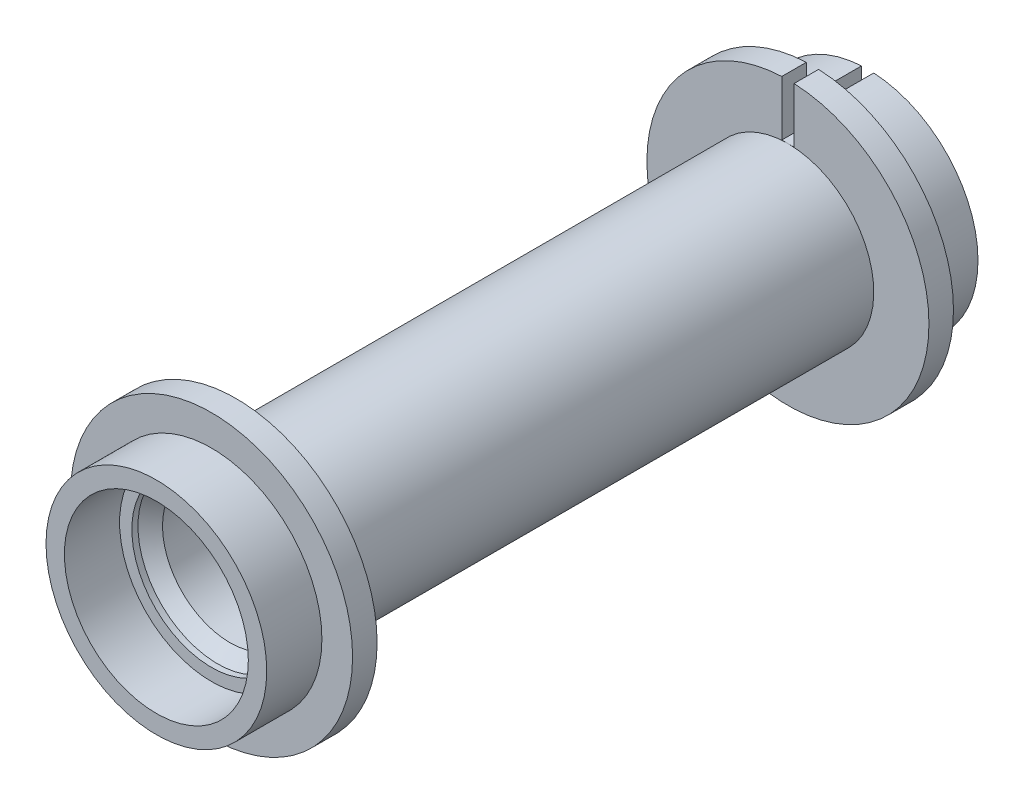
ISO-10303-21;
HEADER;
FILE_DESCRIPTION(('STEP AP214'),'2;1');
FILE_NAME('part.step','',(''),(''),'','','');
FILE_SCHEMA(('AUTOMOTIVE_DESIGN { 1 0 10303 214 1 1 1 1 }'));
ENDSEC;
DATA;
#1=APPLICATION_CONTEXT('core data for automotive mechanical design processes');
#2=APPLICATION_PROTOCOL_DEFINITION('international standard','automotive_design',2000,#1);
#3=PRODUCT_CONTEXT('',#1,'mechanical');
#4=PRODUCT('Part','Part','',(#3));
#5=PRODUCT_RELATED_PRODUCT_CATEGORY('part','',(#4));
#6=PRODUCT_DEFINITION_FORMATION('','',#4);
#7=PRODUCT_DEFINITION_CONTEXT('part definition',#1,'design');
#8=PRODUCT_DEFINITION('design','',#6,#7);
#9=PRODUCT_DEFINITION_SHAPE('','',#8);
#10=(LENGTH_UNIT() NAMED_UNIT(*) SI_UNIT(.MILLI.,.METRE.));
#11=(NAMED_UNIT(*) PLANE_ANGLE_UNIT() SI_UNIT($,.RADIAN.));
#12=(NAMED_UNIT(*) SI_UNIT($,.STERADIAN.) SOLID_ANGLE_UNIT());
#13=UNCERTAINTY_MEASURE_WITH_UNIT(LENGTH_MEASURE(1.E-05),#10,'distance_accuracy_value','');
#14=(GEOMETRIC_REPRESENTATION_CONTEXT(3) GLOBAL_UNCERTAINTY_ASSIGNED_CONTEXT((#13)) GLOBAL_UNIT_ASSIGNED_CONTEXT((#10,
#11,#12)) REPRESENTATION_CONTEXT('',''));
#15=CARTESIAN_POINT('',(0.,0.,0.));
#16=DIRECTION('',(0.,0.,1.));
#17=DIRECTION('',(1.,0.,0.));
#18=AXIS2_PLACEMENT_3D('',#15,#16,#17);
#19=CARTESIAN_POINT('',(0.,0.,-2.));
#20=DIRECTION('',(0.,0.,-1.));
#21=DIRECTION('',(1.,0.,0.));
#22=AXIS2_PLACEMENT_3D('',#19,#20,#21);
#23=PLANE('',#22);
#24=DIRECTION('',(0.,-1.,0.));
#25=VECTOR('',#24,1.);
#26=CARTESIAN_POINT('',(0.5,0.,-2.));
#27=LINE('',#26,#25);
#28=CARTESIAN_POINT('',(0.5,7.48331477354788,-2.));
#29=VERTEX_POINT('',#28);
#30=CARTESIAN_POINT('',(0.5,7.,-2.));
#31=VERTEX_POINT('',#30);
#32=EDGE_CURVE('E133',#29,#31,#27,.T.);
#33=ORIENTED_EDGE('',*,*,#32,.F.);
#34=CARTESIAN_POINT('',(0.,0.,-2.));
#35=DIRECTION('',(0.,0.,1.));
#36=DIRECTION('',(1.,0.,0.));
#37=AXIS2_PLACEMENT_3D('',#34,#35,#36);
#38=CIRCLE('',#37,7.5);
#39=CARTESIAN_POINT('',(-0.5,7.48331477354788,-2.));
#40=VERTEX_POINT('',#39);
#41=EDGE_CURVE('E142',#40,#29,#38,.T.);
#42=ORIENTED_EDGE('',*,*,#41,.F.);
#43=DIRECTION('',(0.,1.,0.));
#44=VECTOR('',#43,1.);
#45=CARTESIAN_POINT('',(-0.500000000000003,0.,-2.));
#46=LINE('',#45,#44);
#47=CARTESIAN_POINT('',(-0.5,7.,-2.));
#48=VERTEX_POINT('',#47);
#49=EDGE_CURVE('E51',#48,#40,#46,.T.);
#50=ORIENTED_EDGE('',*,*,#49,.F.);
#51=DIRECTION('',(-1.,0.,0.));
#52=VECTOR('',#51,1.);
#53=CARTESIAN_POINT('',(0.,7.,-2.));
#54=LINE('',#53,#52);
#55=EDGE_CURVE('E116',#31,#48,#54,.T.);
#56=ORIENTED_EDGE('',*,*,#55,.F.);
#57=EDGE_LOOP('',(#33,#42,#50,#56));
#58=FACE_BOUND('',#57,.T.);
#59=CARTESIAN_POINT('',(0.,0.,-2.));
#60=DIRECTION('',(0.,0.,1.));
#61=DIRECTION('',(1.,0.,0.));
#62=AXIS2_PLACEMENT_3D('',#59,#60,#61);
#63=CIRCLE('',#62,6.5);
#64=CARTESIAN_POINT('',(6.5,0.,-2.));
#65=VERTEX_POINT('',#64);
#66=EDGE_CURVE('E151',#65,#65,#63,.T.);
#67=ORIENTED_EDGE('',*,*,#66,.T.);
#68=EDGE_LOOP('',(#67));
#69=FACE_BOUND('',#68,.T.);
#70=ADVANCED_FACE('F36',(#58,#69),#23,.T.);
#71=CARTESIAN_POINT('',(0.,0.,47.));
#72=DIRECTION('',(0.,0.,1.));
#73=DIRECTION('',(1.,0.,0.));
#74=AXIS2_PLACEMENT_3D('',#71,#72,#73);
#75=PLANE('',#74);
#76=CARTESIAN_POINT('',(0.,0.,47.));
#77=DIRECTION('',(0.,0.,1.));
#78=DIRECTION('',(1.,0.,0.));
#79=AXIS2_PLACEMENT_3D('',#76,#77,#78);
#80=CIRCLE('',#79,6.5);
#81=CARTESIAN_POINT('',(6.5,0.,47.));
#82=VERTEX_POINT('',#81);
#83=EDGE_CURVE('E167',#82,#82,#80,.T.);
#84=ORIENTED_EDGE('',*,*,#83,.F.);
#85=EDGE_LOOP('',(#84));
#86=FACE_BOUND('',#85,.T.);
#87=CARTESIAN_POINT('',(0.,0.,47.));
#88=DIRECTION('',(0.,0.,1.));
#89=DIRECTION('',(1.,0.,0.));
#90=AXIS2_PLACEMENT_3D('',#87,#88,#89);
#91=CIRCLE('',#90,7.5);
#92=CARTESIAN_POINT('',(7.5,0.,47.));
#93=VERTEX_POINT('',#92);
#94=EDGE_CURVE('E181',#93,#93,#91,.F.);
#95=ORIENTED_EDGE('',*,*,#94,.F.);
#96=EDGE_LOOP('',(#95));
#97=FACE_BOUND('',#96,.T.);
#98=ADVANCED_FACE('F235',(#86,#97),#75,.T.);
#99=CARTESIAN_POINT('',(0.,0.,45.));
#100=DIRECTION('',(0.,0.,-1.));
#101=DIRECTION('',(-1.,0.,0.));
#102=AXIS2_PLACEMENT_3D('',#99,#100,#101);
#103=CYLINDRICAL_SURFACE('',#102,7.);
#104=CARTESIAN_POINT('',(0.,0.,45.));
#105=DIRECTION('',(0.,0.,1.));
#106=DIRECTION('',(1.,0.,0.));
#107=AXIS2_PLACEMENT_3D('',#104,#105,#106);
#108=CIRCLE('',#107,7.);
#109=CARTESIAN_POINT('',(7.,0.,45.));
#110=VERTEX_POINT('',#109);
#111=EDGE_CURVE('E176',#110,#110,#108,.T.);
#112=ORIENTED_EDGE('',*,*,#111,.F.);
#113=EDGE_LOOP('',(#112));
#114=FACE_BOUND('',#113,.T.);
#115=CARTESIAN_POINT('',(0.,0.,0.));
#116=DIRECTION('',(0.,0.,-1.));
#117=DIRECTION('',(-1.,0.,0.));
#118=AXIS2_PLACEMENT_3D('',#115,#116,#117);
#119=CIRCLE('',#118,7.);
#120=CARTESIAN_POINT('',(0.,7.,0.));
#121=VERTEX_POINT('',#120);
#122=EDGE_CURVE('E122',#121,#121,#119,.T.);
#123=ORIENTED_EDGE('',*,*,#122,.F.);
#124=EDGE_LOOP('',(#123));
#125=FACE_BOUND('',#124,.T.);
#126=ADVANCED_FACE('F285',(#114,#125),#103,.T.);
#127=CARTESIAN_POINT('',(0.,0.,45.));
#128=DIRECTION('',(0.,0.,-1.));
#129=DIRECTION('',(-1.,0.,0.));
#130=AXIS2_PLACEMENT_3D('',#127,#128,#129);
#131=CYLINDRICAL_SURFACE('',#130,5.5);
#132=CARTESIAN_POINT('',(0.,0.,45.5));
#133=DIRECTION('',(0.,0.,1.));
#134=DIRECTION('',(1.,0.,0.));
#135=AXIS2_PLACEMENT_3D('',#132,#133,#134);
#136=CIRCLE('',#135,5.5);
#137=CARTESIAN_POINT('',(-5.5,0.,45.5));
#138=VERTEX_POINT('',#137);
#139=EDGE_CURVE('E196',#138,#138,#136,.T.);
#140=CARTESIAN_POINT('',(0.,0.,-0.500000000000015));
#141=DIRECTION('',(0.,0.,-1.));
#142=DIRECTION('',(-1.,0.,0.));
#143=AXIS2_PLACEMENT_3D('',#140,#141,#142);
#144=CIRCLE('',#143,5.5);
#145=CARTESIAN_POINT('',(-5.5,0.,-0.500000000000021));
#146=VERTEX_POINT('',#145);
#147=EDGE_CURVE('E193',#146,#146,#144,.T.);
#148=CARTESIAN_POINT('',(-5.5,0.,45.5));
#149=CARTESIAN_POINT('',(-5.5,0.,45.0208333333333));
#150=CARTESIAN_POINT('',(-5.5,0.,44.5416666666667));
#151=CARTESIAN_POINT('',(-5.5,0.,43.5833333333333));
#152=CARTESIAN_POINT('',(-5.5,0.,43.1041666666667));
#153=CARTESIAN_POINT('',(-5.5,0.,42.1458333333333));
#154=CARTESIAN_POINT('',(-5.5,0.,41.6666666666667));
#155=CARTESIAN_POINT('',(-5.5,0.,40.7083333333333));
#156=CARTESIAN_POINT('',(-5.5,0.,40.2291666666667));
#157=CARTESIAN_POINT('',(-5.5,0.,39.2708333333333));
#158=CARTESIAN_POINT('',(-5.5,0.,38.7916666666667));
#159=CARTESIAN_POINT('',(-5.5,0.,37.8333333333333));
#160=CARTESIAN_POINT('',(-5.5,0.,37.3541666666667));
#161=CARTESIAN_POINT('',(-5.5,0.,36.3958333333333));
#162=CARTESIAN_POINT('',(-5.5,0.,35.9166666666667));
#163=CARTESIAN_POINT('',(-5.5,0.,34.9583333333333));
#164=CARTESIAN_POINT('',(-5.5,0.,34.4791666666667));
#165=CARTESIAN_POINT('',(-5.5,0.,33.5208333333333));
#166=CARTESIAN_POINT('',(-5.5,0.,33.0416666666667));
#167=CARTESIAN_POINT('',(-5.5,0.,32.0833333333333));
#168=CARTESIAN_POINT('',(-5.5,0.,31.6041666666667));
#169=CARTESIAN_POINT('',(-5.5,0.,30.6458333333333));
#170=CARTESIAN_POINT('',(-5.5,0.,30.1666666666667));
#171=CARTESIAN_POINT('',(-5.5,0.,29.2083333333333));
#172=CARTESIAN_POINT('',(-5.5,0.,28.7291666666667));
#173=CARTESIAN_POINT('',(-5.5,0.,27.7708333333333));
#174=CARTESIAN_POINT('',(-5.5,0.,27.2916666666667));
#175=CARTESIAN_POINT('',(-5.5,0.,26.3333333333333));
#176=CARTESIAN_POINT('',(-5.5,0.,25.8541666666667));
#177=CARTESIAN_POINT('',(-5.5,0.,24.8958333333333));
#178=CARTESIAN_POINT('',(-5.5,0.,24.4166666666667));
#179=CARTESIAN_POINT('',(-5.5,0.,23.4583333333333));
#180=CARTESIAN_POINT('',(-5.5,0.,22.9791666666667));
#181=CARTESIAN_POINT('',(-5.5,0.,22.0208333333333));
#182=CARTESIAN_POINT('',(-5.5,0.,21.5416666666667));
#183=CARTESIAN_POINT('',(-5.5,0.,20.5833333333333));
#184=CARTESIAN_POINT('',(-5.5,0.,20.1041666666667));
#185=CARTESIAN_POINT('',(-5.5,0.,19.1458333333333));
#186=CARTESIAN_POINT('',(-5.5,0.,18.6666666666667));
#187=CARTESIAN_POINT('',(-5.5,0.,17.7083333333333));
#188=CARTESIAN_POINT('',(-5.5,0.,17.2291666666667));
#189=CARTESIAN_POINT('',(-5.5,0.,16.2708333333333));
#190=CARTESIAN_POINT('',(-5.5,0.,15.7916666666667));
#191=CARTESIAN_POINT('',(-5.5,0.,14.8333333333333));
#192=CARTESIAN_POINT('',(-5.5,0.,14.3541666666667));
#193=CARTESIAN_POINT('',(-5.5,0.,13.3958333333333));
#194=CARTESIAN_POINT('',(-5.5,0.,12.9166666666667));
#195=CARTESIAN_POINT('',(-5.5,0.,11.9583333333333));
#196=CARTESIAN_POINT('',(-5.5,0.,11.4791666666667));
#197=CARTESIAN_POINT('',(-5.5,0.,10.5208333333333));
#198=CARTESIAN_POINT('',(-5.5,0.,10.0416666666667));
#199=CARTESIAN_POINT('',(-5.5,0.,9.08333333333332));
#200=CARTESIAN_POINT('',(-5.5,0.,8.60416666666665));
#201=CARTESIAN_POINT('',(-5.5,0.,7.64583333333332));
#202=CARTESIAN_POINT('',(-5.5,0.,7.16666666666665));
#203=CARTESIAN_POINT('',(-5.5,0.,6.20833333333331));
#204=CARTESIAN_POINT('',(-5.5,0.,5.72916666666665));
#205=CARTESIAN_POINT('',(-5.5,0.,4.77083333333331));
#206=CARTESIAN_POINT('',(-5.5,0.,4.29166666666664));
#207=CARTESIAN_POINT('',(-5.5,0.,3.33333333333331));
#208=CARTESIAN_POINT('',(-5.5,0.,2.85416666666665));
#209=CARTESIAN_POINT('',(-5.5,0.,1.89583333333331));
#210=CARTESIAN_POINT('',(-5.5,0.,1.41666666666664));
#211=CARTESIAN_POINT('',(-5.5,0.,0.458333333333308));
#212=CARTESIAN_POINT('',(-5.5,0.,-0.0208333333333567));
#213=CARTESIAN_POINT('',(-5.5,0.,-0.500000000000021));
#214=B_SPLINE_CURVE_WITH_KNOTS('',3,(#148,#149,#150,#151,#152,#153,#154,#155,#156,#157,#158,
#159,#160,#161,#162,#163,#164,#165,#166,#167,#168,#169,#170,#171,#172,#173,#174,#175,#176,#177,
#178,#179,#180,#181,#182,#183,#184,#185,#186,#187,#188,#189,#190,#191,#192,#193,#194,#195,#196,
#197,#198,#199,#200,#201,#202,#203,#204,#205,#206,#207,#208,#209,#210,#211,#212,#213),
.UNSPECIFIED.,.F.,.F.,(4,2,2,2,2,2,2,2,2,2,2,2,2,2,2,2,2,2,2,2,2,2,2,2,2,2,2,2,2,2,2,2,4),(0.,
1.43749999999999,2.875,4.3125,5.75,7.1875,8.625,10.0625,11.5,12.9375,14.375,15.8125,17.25,
18.6875,20.125,21.5625,23.,24.4375,25.875,27.3125,28.75,30.1875,31.625,33.0625,34.5,35.9375,
37.375,38.8125,40.25,41.6875,43.125,44.5625,46.),.UNSPECIFIED.);
#215=EDGE_CURVE('BSEAM278',#138,#146,#214,.T.);
#216=ORIENTED_EDGE('',*,*,#139,.T.);
#217=ORIENTED_EDGE('',*,*,#147,.T.);
#218=ORIENTED_EDGE('',*,*,#215,.T.);
#219=ORIENTED_EDGE('',*,*,#215,.F.);
#220=EDGE_LOOP('',(#216,#218,#217,#219));
#221=FACE_BOUND('',#220,.T.);
#222=ADVANCED_FACE('F278',(#221),#131,.F.);
#223=CARTESIAN_POINT('',(0.,0.,45.));
#224=DIRECTION('',(0.,0.,1.));
#225=DIRECTION('',(1.,0.,0.));
#226=AXIS2_PLACEMENT_3D('',#223,#224,#225);
#227=PLANE('',#226);
#228=CARTESIAN_POINT('',(0.,0.,45.));
#229=DIRECTION('',(0.,0.,1.));
#230=DIRECTION('',(1.,0.,0.));
#231=AXIS2_PLACEMENT_3D('',#228,#229,#230);
#232=CIRCLE('',#231,11.5);
#233=CARTESIAN_POINT('',(11.5,0.,45.));
#234=VERTEX_POINT('',#233);
#235=EDGE_CURVE('E172',#234,#234,#232,.T.);
#236=ORIENTED_EDGE('',*,*,#235,.F.);
#237=EDGE_LOOP('',(#236));
#238=FACE_BOUND('',#237,.T.);
#239=ORIENTED_EDGE('',*,*,#111,.T.);
#240=EDGE_LOOP('',(#239));
#241=FACE_BOUND('',#240,.T.);
#242=ADVANCED_FACE('F274',(#238,#241),#227,.F.);
#243=CARTESIAN_POINT('',(0.,0.,47.));
#244=DIRECTION('',(0.,0.,1.));
#245=DIRECTION('',(1.,0.,0.));
#246=AXIS2_PLACEMENT_3D('',#243,#244,#245);
#247=CIRCLE('',#246,9.);
#248=CARTESIAN_POINT('',(9.,0.,47.));
#249=VERTEX_POINT('',#248);
#250=EDGE_CURVE('E163',#249,#249,#247,.T.);
#251=ORIENTED_EDGE('',*,*,#250,.F.);
#252=EDGE_LOOP('',(#251));
#253=FACE_BOUND('',#252,.T.);
#254=CARTESIAN_POINT('',(0.,0.,47.));
#255=DIRECTION('',(0.,0.,1.));
#256=DIRECTION('',(1.,0.,0.));
#257=AXIS2_PLACEMENT_3D('',#254,#255,#256);
#258=CIRCLE('',#257,11.5);
#259=CARTESIAN_POINT('',(11.5,0.,47.));
#260=VERTEX_POINT('',#259);
#261=EDGE_CURVE('E173',#260,#260,#258,.T.);
#262=ORIENTED_EDGE('',*,*,#261,.T.);
#263=EDGE_LOOP('',(#262));
#264=FACE_BOUND('',#263,.T.);
#265=ADVANCED_FACE('F271',(#253,#264),#75,.T.);
#266=CARTESIAN_POINT('',(0.,0.,47.));
#267=DIRECTION('',(0.,0.,-1.));
#268=DIRECTION('',(-1.,0.,0.));
#269=AXIS2_PLACEMENT_3D('',#266,#267,#268);
#270=CYLINDRICAL_SURFACE('',#269,11.5);
#271=ORIENTED_EDGE('',*,*,#261,.F.);
#272=EDGE_LOOP('',(#271));
#273=FACE_BOUND('',#272,.T.);
#274=ORIENTED_EDGE('',*,*,#235,.T.);
#275=EDGE_LOOP('',(#274));
#276=FACE_BOUND('',#275,.T.);
#277=ADVANCED_FACE('F269',(#273,#276),#270,.T.);
#278=CARTESIAN_POINT('',(0.,0.,47.));
#279=DIRECTION('',(0.,0.,-1.));
#280=DIRECTION('',(-1.,0.,0.));
#281=AXIS2_PLACEMENT_3D('',#278,#279,#280);
#282=CYLINDRICAL_SURFACE('',#281,6.5);
#283=CARTESIAN_POINT('',(0.,0.,46.5));
#284=DIRECTION('',(0.,0.,1.));
#285=DIRECTION('',(1.,0.,0.));
#286=AXIS2_PLACEMENT_3D('',#283,#284,#285);
#287=CIRCLE('',#286,6.5);
#288=CARTESIAN_POINT('',(6.5,0.,46.5));
#289=VERTEX_POINT('',#288);
#290=EDGE_CURVE('E190',#289,#289,#287,.F.);
#291=ORIENTED_EDGE('',*,*,#290,.T.);
#292=EDGE_LOOP('',(#291));
#293=FACE_BOUND('',#292,.T.);
#294=ORIENTED_EDGE('',*,*,#83,.T.);
#295=EDGE_LOOP('',(#294));
#296=FACE_BOUND('',#295,.T.);
#297=ADVANCED_FACE('F262',(#293,#296),#282,.F.);
#298=CARTESIAN_POINT('',(0.,0.,51.5));
#299=DIRECTION('',(0.,0.,1.));
#300=DIRECTION('',(1.,0.,0.));
#301=AXIS2_PLACEMENT_3D('',#298,#299,#300);
#302=PLANE('',#301);
#303=CARTESIAN_POINT('',(0.,0.,51.5));
#304=DIRECTION('',(0.,0.,1.));
#305=DIRECTION('',(1.,0.,0.));
#306=AXIS2_PLACEMENT_3D('',#303,#304,#305);
#307=CIRCLE('',#306,9.);
#308=CARTESIAN_POINT('',(9.,0.,51.5));
#309=VERTEX_POINT('',#308);
#310=EDGE_CURVE('E164',#309,#309,#307,.T.);
#311=ORIENTED_EDGE('',*,*,#310,.T.);
#312=EDGE_LOOP('',(#311));
#313=FACE_BOUND('',#312,.T.);
#314=CARTESIAN_POINT('',(0.,0.,51.5));
#315=DIRECTION('',(0.,0.,1.));
#316=DIRECTION('',(1.,0.,0.));
#317=AXIS2_PLACEMENT_3D('',#314,#315,#316);
#318=CIRCLE('',#317,7.5);
#319=CARTESIAN_POINT('',(7.5,0.,51.5));
#320=VERTEX_POINT('',#319);
#321=EDGE_CURVE('E160',#320,#320,#318,.T.);
#322=ORIENTED_EDGE('',*,*,#321,.F.);
#323=EDGE_LOOP('',(#322));
#324=FACE_BOUND('',#323,.T.);
#325=ADVANCED_FACE('F259',(#313,#324),#302,.T.);
#326=CARTESIAN_POINT('',(0.,0.,51.5));
#327=DIRECTION('',(0.,0.,-1.));
#328=DIRECTION('',(-1.,0.,0.));
#329=AXIS2_PLACEMENT_3D('',#326,#327,#328);
#330=CYLINDRICAL_SURFACE('',#329,9.);
#331=ORIENTED_EDGE('',*,*,#310,.F.);
#332=EDGE_LOOP('',(#331));
#333=FACE_BOUND('',#332,.T.);
#334=ORIENTED_EDGE('',*,*,#250,.T.);
#335=EDGE_LOOP('',(#334));
#336=FACE_BOUND('',#335,.T.);
#337=ADVANCED_FACE('F257',(#333,#336),#330,.T.);
#338=CARTESIAN_POINT('',(0.,0.,51.5));
#339=DIRECTION('',(0.,0.,-1.));
#340=DIRECTION('',(-1.,0.,0.));
#341=AXIS2_PLACEMENT_3D('',#338,#339,#340);
#342=CYLINDRICAL_SURFACE('',#341,7.5);
#343=ORIENTED_EDGE('',*,*,#321,.T.);
#344=EDGE_LOOP('',(#343));
#345=FACE_BOUND('',#344,.T.);
#346=ORIENTED_EDGE('',*,*,#94,.T.);
#347=EDGE_LOOP('',(#346));
#348=FACE_BOUND('',#347,.T.);
#349=ADVANCED_FACE('F254',(#345,#348),#342,.F.);
#350=CARTESIAN_POINT('',(0.,0.,-2.));
#351=DIRECTION('',(0.,0.,1.));
#352=DIRECTION('',(1.,0.,0.));
#353=AXIS2_PLACEMENT_3D('',#350,#351,#352);
#354=CYLINDRICAL_SURFACE('',#353,11.5);
#355=DIRECTION('',(0.,0.,1.));
#356=VECTOR('',#355,1.);
#357=CARTESIAN_POINT('',(0.5,11.4891252930761,-2.));
#358=LINE('',#357,#356);
#359=CARTESIAN_POINT('',(0.5,11.4891252930761,0.));
#360=VERTEX_POINT('',#359);
#361=CARTESIAN_POINT('',(0.5,11.4891252930761,-2.));
#362=VERTEX_POINT('',#361);
#363=EDGE_CURVE('E139',#360,#362,#358,.F.);
#364=ORIENTED_EDGE('',*,*,#363,.F.);
#365=CARTESIAN_POINT('',(0.,0.,0.));
#366=DIRECTION('',(0.,0.,1.));
#367=DIRECTION('',(1.,0.,0.));
#368=AXIS2_PLACEMENT_3D('',#365,#366,#367);
#369=CIRCLE('',#368,11.5);
#370=CARTESIAN_POINT('',(-0.499999999999998,11.4891252930761,0.));
#371=VERTEX_POINT('',#370);
#372=EDGE_CURVE('E154',#371,#360,#369,.T.);
#373=ORIENTED_EDGE('',*,*,#372,.F.);
#374=DIRECTION('',(0.,0.,1.));
#375=VECTOR('',#374,1.);
#376=CARTESIAN_POINT('',(-0.499999999999998,11.4891252930761,-2.));
#377=LINE('',#376,#375);
#378=CARTESIAN_POINT('',(-0.499999999999998,11.4891252930761,-2.));
#379=VERTEX_POINT('',#378);
#380=EDGE_CURVE('E107',#379,#371,#377,.T.);
#381=ORIENTED_EDGE('',*,*,#380,.F.);
#382=CARTESIAN_POINT('',(0.,0.,-2.));
#383=DIRECTION('',(0.,0.,1.));
#384=DIRECTION('',(1.,0.,0.));
#385=AXIS2_PLACEMENT_3D('',#382,#383,#384);
#386=CIRCLE('',#385,11.5);
#387=EDGE_CURVE('E155',#379,#362,#386,.T.);
#388=ORIENTED_EDGE('',*,*,#387,.T.);
#389=EDGE_LOOP('',(#364,#373,#381,#388));
#390=FACE_BOUND('',#389,.T.);
#391=ADVANCED_FACE('F229',(#390),#354,.T.);
#392=DIRECTION('',(0.,-1.,0.));
#393=VECTOR('',#392,1.);
#394=CARTESIAN_POINT('',(0.5,0.,-2.));
#395=LINE('',#394,#393);
#396=CARTESIAN_POINT('',(0.5,8.98610037780571,-2.));
#397=VERTEX_POINT('',#396);
#398=EDGE_CURVE('E137',#362,#397,#395,.T.);
#399=ORIENTED_EDGE('',*,*,#398,.F.);
#400=ORIENTED_EDGE('',*,*,#387,.F.);
#401=DIRECTION('',(0.,1.,0.));
#402=VECTOR('',#401,1.);
#403=CARTESIAN_POINT('',(-0.500000000000003,0.,-2.));
#404=LINE('',#403,#402);
#405=CARTESIAN_POINT('',(-0.499999999999999,8.98610037780571,-2.));
#406=VERTEX_POINT('',#405);
#407=EDGE_CURVE('E130',#406,#379,#404,.T.);
#408=ORIENTED_EDGE('',*,*,#407,.F.);
#409=CARTESIAN_POINT('',(0.,0.,-2.));
#410=DIRECTION('',(0.,0.,-1.));
#411=DIRECTION('',(-1.,0.,0.));
#412=AXIS2_PLACEMENT_3D('',#409,#410,#411);
#413=CIRCLE('',#412,9.);
#414=EDGE_CURVE('E184',#397,#406,#413,.T.);
#415=ORIENTED_EDGE('',*,*,#414,.F.);
#416=EDGE_LOOP('',(#399,#400,#408,#415));
#417=FACE_BOUND('',#416,.T.);
#418=ADVANCED_FACE('F225',(#417),#23,.T.);
#419=CARTESIAN_POINT('',(0.,0.,0.));
#420=DIRECTION('',(0.,0.,-1.));
#421=DIRECTION('',(1.,0.,0.));
#422=AXIS2_PLACEMENT_3D('',#419,#420,#421);
#423=PLANE('',#422);
#424=ORIENTED_EDGE('',*,*,#372,.T.);
#425=DIRECTION('',(0.,1.,0.));
#426=VECTOR('',#425,1.);
#427=CARTESIAN_POINT('',(0.5,7.,0.));
#428=LINE('',#427,#426);
#429=CARTESIAN_POINT('',(0.5,7.,0.));
#430=VERTEX_POINT('',#429);
#431=EDGE_CURVE('E111',#430,#360,#428,.T.);
#432=ORIENTED_EDGE('',*,*,#431,.F.);
#433=DIRECTION('',(-1.,0.,0.));
#434=VECTOR('',#433,1.);
#435=CARTESIAN_POINT('',(0.,7.,0.));
#436=LINE('',#435,#434);
#437=EDGE_CURVE('E11',#430,#121,#436,.T.);
#438=ORIENTED_EDGE('',*,*,#437,.T.);
#439=ORIENTED_EDGE('',*,*,#122,.T.);
#440=DIRECTION('',(1.,0.,0.));
#441=VECTOR('',#440,1.);
#442=CARTESIAN_POINT('',(0.5,7.,0.));
#443=LINE('',#442,#441);
#444=CARTESIAN_POINT('',(-0.5,7.,0.));
#445=VERTEX_POINT('',#444);
#446=EDGE_CURVE('E59',#445,#121,#443,.T.);
#447=ORIENTED_EDGE('',*,*,#446,.F.);
#448=DIRECTION('',(0.,-1.,0.));
#449=VECTOR('',#448,1.);
#450=CARTESIAN_POINT('',(-0.499999999999998,12.9563859663963,0.));
#451=LINE('',#450,#449);
#452=EDGE_CURVE('E103',#371,#445,#451,.T.);
#453=ORIENTED_EDGE('',*,*,#452,.F.);
#454=EDGE_LOOP('',(#424,#432,#438,#439,#447,#453));
#455=FACE_BOUND('',#454,.T.);
#456=ADVANCED_FACE('F120',(#455),#423,.F.);
#457=CARTESIAN_POINT('',(0.,0.,-2.));
#458=DIRECTION('',(0.,0.,1.));
#459=DIRECTION('',(1.,0.,0.));
#460=AXIS2_PLACEMENT_3D('',#457,#458,#459);
#461=CYLINDRICAL_SURFACE('',#460,6.5);
#462=CARTESIAN_POINT('',(0.,0.,-1.50000000000003));
#463=DIRECTION('',(0.,0.,1.));
#464=DIRECTION('',(1.,0.,0.));
#465=AXIS2_PLACEMENT_3D('',#462,#463,#464);
#466=CIRCLE('',#465,6.5);
#467=CARTESIAN_POINT('',(6.5,0.,-1.50000000000003));
#468=VERTEX_POINT('',#467);
#469=EDGE_CURVE('E187',#468,#468,#466,.T.);
#470=ORIENTED_EDGE('',*,*,#469,.T.);
#471=EDGE_LOOP('',(#470));
#472=FACE_BOUND('',#471,.T.);
#473=ORIENTED_EDGE('',*,*,#66,.F.);
#474=EDGE_LOOP('',(#473));
#475=FACE_BOUND('',#474,.T.);
#476=ADVANCED_FACE('F239',(#472,#475),#461,.F.);
#477=CARTESIAN_POINT('',(0.,0.,-6.5));
#478=DIRECTION('',(0.,0.,1.));
#479=DIRECTION('',(1.,0.,0.));
#480=AXIS2_PLACEMENT_3D('',#477,#478,#479);
#481=CYLINDRICAL_SURFACE('',#480,9.);
#482=DIRECTION('',(0.,0.,1.));
#483=VECTOR('',#482,1.);
#484=CARTESIAN_POINT('',(0.5,8.98610037780571,-6.5));
#485=LINE('',#484,#483);
#486=CARTESIAN_POINT('',(0.5,8.98610037780571,-6.5));
#487=VERTEX_POINT('',#486);
#488=EDGE_CURVE('E135',#397,#487,#485,.F.);
#489=ORIENTED_EDGE('',*,*,#488,.F.);
#490=ORIENTED_EDGE('',*,*,#414,.T.);
#491=DIRECTION('',(0.,0.,1.));
#492=VECTOR('',#491,1.);
#493=CARTESIAN_POINT('',(-0.499999999999999,8.98610037780571,-6.5));
#494=LINE('',#493,#492);
#495=CARTESIAN_POINT('',(-0.499999999999999,8.98610037780571,-6.5));
#496=VERTEX_POINT('',#495);
#497=EDGE_CURVE('E124',#496,#406,#494,.T.);
#498=ORIENTED_EDGE('',*,*,#497,.F.);
#499=CARTESIAN_POINT('',(0.,0.,-6.5));
#500=DIRECTION('',(0.,0.,1.));
#501=DIRECTION('',(1.,0.,0.));
#502=AXIS2_PLACEMENT_3D('',#499,#500,#501);
#503=CIRCLE('',#502,9.);
#504=EDGE_CURVE('E146',#496,#487,#503,.T.);
#505=ORIENTED_EDGE('',*,*,#504,.T.);
#506=EDGE_LOOP('',(#489,#490,#498,#505));
#507=FACE_BOUND('',#506,.T.);
#508=ADVANCED_FACE('F222',(#507),#481,.T.);
#509=CARTESIAN_POINT('',(0.,0.,-6.5));
#510=DIRECTION('',(0.,0.,-1.));
#511=DIRECTION('',(1.,0.,0.));
#512=AXIS2_PLACEMENT_3D('',#509,#510,#511);
#513=PLANE('',#512);
#514=DIRECTION('',(0.,-1.,0.));
#515=VECTOR('',#514,1.);
#516=CARTESIAN_POINT('',(0.5,7.,-6.5));
#517=LINE('',#516,#515);
#518=CARTESIAN_POINT('',(0.5,7.48331477354788,-6.5));
#519=VERTEX_POINT('',#518);
#520=EDGE_CURVE('E212',#487,#519,#517,.T.);
#521=ORIENTED_EDGE('',*,*,#520,.F.);
#522=ORIENTED_EDGE('',*,*,#504,.F.);
#523=DIRECTION('',(0.,1.,0.));
#524=VECTOR('',#523,1.);
#525=CARTESIAN_POINT('',(-0.499999999999998,12.9563859663963,-6.5));
#526=LINE('',#525,#524);
#527=CARTESIAN_POINT('',(-0.5,7.48331477354788,-6.5));
#528=VERTEX_POINT('',#527);
#529=EDGE_CURVE('E213',#528,#496,#526,.T.);
#530=ORIENTED_EDGE('',*,*,#529,.F.);
#531=CARTESIAN_POINT('',(0.,0.,-6.5));
#532=DIRECTION('',(0.,0.,1.));
#533=DIRECTION('',(1.,0.,0.));
#534=AXIS2_PLACEMENT_3D('',#531,#532,#533);
#535=CIRCLE('',#534,7.5);
#536=EDGE_CURVE('E143',#528,#519,#535,.T.);
#537=ORIENTED_EDGE('',*,*,#536,.T.);
#538=EDGE_LOOP('',(#521,#522,#530,#537));
#539=FACE_BOUND('',#538,.T.);
#540=ADVANCED_FACE('F210',(#539),#513,.T.);
#541=CARTESIAN_POINT('',(0.,0.,-6.5));
#542=DIRECTION('',(0.,0.,1.));
#543=DIRECTION('',(1.,0.,0.));
#544=AXIS2_PLACEMENT_3D('',#541,#542,#543);
#545=CYLINDRICAL_SURFACE('',#544,7.5);
#546=ORIENTED_EDGE('',*,*,#41,.T.);
#547=DIRECTION('',(0.,0.,1.));
#548=VECTOR('',#547,1.);
#549=CARTESIAN_POINT('',(0.5,7.48331477354788,-6.5));
#550=LINE('',#549,#548);
#551=EDGE_CURVE('E44',#29,#519,#550,.F.);
#552=ORIENTED_EDGE('',*,*,#551,.T.);
#553=ORIENTED_EDGE('',*,*,#536,.F.);
#554=DIRECTION('',(0.,0.,1.));
#555=VECTOR('',#554,1.);
#556=CARTESIAN_POINT('',(-0.5,7.48331477354788,-6.5));
#557=LINE('',#556,#555);
#558=EDGE_CURVE('E199',#528,#40,#557,.T.);
#559=ORIENTED_EDGE('',*,*,#558,.T.);
#560=EDGE_LOOP('',(#546,#552,#553,#559));
#561=FACE_BOUND('',#560,.T.);
#562=ADVANCED_FACE('F203',(#561),#545,.F.);
#563=CARTESIAN_POINT('',(0.,0.,-1.50000000000003));
#564=DIRECTION('',(0.,0.,-1.));
#565=DIRECTION('',(-1.,0.,0.));
#566=AXIS2_PLACEMENT_3D('',#563,#564,#565);
#567=CONICAL_SURFACE('',#566,6.5,0.785398163397443);
#568=ORIENTED_EDGE('',*,*,#147,.F.);
#569=EDGE_LOOP('',(#568));
#570=FACE_BOUND('',#569,.T.);
#571=ORIENTED_EDGE('',*,*,#469,.F.);
#572=EDGE_LOOP('',(#571));
#573=FACE_BOUND('',#572,.T.);
#574=ADVANCED_FACE('F289',(#570,#573),#567,.F.);
#575=CARTESIAN_POINT('',(0.,0.,46.5));
#576=DIRECTION('',(0.,0.,1.));
#577=DIRECTION('',(1.,0.,0.));
#578=AXIS2_PLACEMENT_3D('',#575,#576,#577);
#579=CONICAL_SURFACE('',#578,6.5,0.785398163397442);
#580=ORIENTED_EDGE('',*,*,#139,.F.);
#581=EDGE_LOOP('',(#580));
#582=FACE_BOUND('',#581,.T.);
#583=ORIENTED_EDGE('',*,*,#290,.F.);
#584=EDGE_LOOP('',(#583));
#585=FACE_BOUND('',#584,.T.);
#586=ADVANCED_FACE('F38',(#582,#585),#579,.F.);
#587=CARTESIAN_POINT('',(0.5,7.,6.03974616856395));
#588=DIRECTION('',(1.,0.,0.));
#589=DIRECTION('',(0.,0.,-1.));
#590=AXIS2_PLACEMENT_3D('',#587,#588,#589);
#591=PLANE('',#590);
#592=ORIENTED_EDGE('',*,*,#363,.T.);
#593=ORIENTED_EDGE('',*,*,#398,.T.);
#594=ORIENTED_EDGE('',*,*,#488,.T.);
#595=ORIENTED_EDGE('',*,*,#520,.T.);
#596=ORIENTED_EDGE('',*,*,#551,.F.);
#597=ORIENTED_EDGE('',*,*,#32,.T.);
#598=DIRECTION('',(0.,0.,-1.));
#599=VECTOR('',#598,1.);
#600=CARTESIAN_POINT('',(0.5,7.,6.03974616856395));
#601=LINE('',#600,#599);
#602=EDGE_CURVE('E117',#430,#31,#601,.T.);
#603=ORIENTED_EDGE('',*,*,#602,.F.);
#604=ORIENTED_EDGE('',*,*,#431,.T.);
#605=EDGE_LOOP('',(#592,#593,#594,#595,#596,#597,#603,#604));
#606=FACE_BOUND('',#605,.T.);
#607=ADVANCED_FACE('F217',(#606),#591,.F.);
#608=CARTESIAN_POINT('',(-0.499999999999998,12.9563859663963,6.03974616856395));
#609=DIRECTION('',(-1.,0.,0.));
#610=DIRECTION('',(0.,-1.,0.));
#611=AXIS2_PLACEMENT_3D('',#608,#609,#610);
#612=PLANE('',#611);
#613=ORIENTED_EDGE('',*,*,#380,.T.);
#614=ORIENTED_EDGE('',*,*,#452,.T.);
#615=DIRECTION('',(0.,0.,-1.));
#616=VECTOR('',#615,1.);
#617=CARTESIAN_POINT('',(-0.5,7.,6.03974616856395));
#618=LINE('',#617,#616);
#619=EDGE_CURVE('E105',#445,#48,#618,.T.);
#620=ORIENTED_EDGE('',*,*,#619,.T.);
#621=ORIENTED_EDGE('',*,*,#49,.T.);
#622=ORIENTED_EDGE('',*,*,#558,.F.);
#623=ORIENTED_EDGE('',*,*,#529,.T.);
#624=ORIENTED_EDGE('',*,*,#497,.T.);
#625=ORIENTED_EDGE('',*,*,#407,.T.);
#626=EDGE_LOOP('',(#613,#614,#620,#621,#622,#623,#624,#625));
#627=FACE_BOUND('',#626,.T.);
#628=ADVANCED_FACE('F104',(#627),#612,.F.);
#629=CARTESIAN_POINT('',(0.5,7.,6.03974616856395));
#630=DIRECTION('',(0.,-1.,0.));
#631=DIRECTION('',(0.,0.,-1.));
#632=AXIS2_PLACEMENT_3D('',#629,#630,#631);
#633=PLANE('',#632);
#634=ORIENTED_EDGE('',*,*,#55,.T.);
#635=ORIENTED_EDGE('',*,*,#619,.F.);
#636=ORIENTED_EDGE('',*,*,#446,.T.);
#637=ORIENTED_EDGE('',*,*,#437,.F.);
#638=ORIENTED_EDGE('',*,*,#602,.T.);
#639=EDGE_LOOP('',(#634,#635,#636,#637,#638));
#640=FACE_BOUND('',#639,.T.);
#641=ADVANCED_FACE('F113',(#640),#633,.F.);
#642=CLOSED_SHELL('',(#70,#98,#126,#222,#242,#265,#277,#297,#325,#337,#349,#391,#418,#456,#476,
#508,#540,#562,#574,#586,#607,#628,#641));
#643=MANIFOLD_SOLID_BREP('B2',#642);
#644=ADVANCED_BREP_SHAPE_REPRESENTATION('',(#18,#643),#14);
#645=SHAPE_DEFINITION_REPRESENTATION(#9,#644);
ENDSEC;
END-ISO-10303-21;
